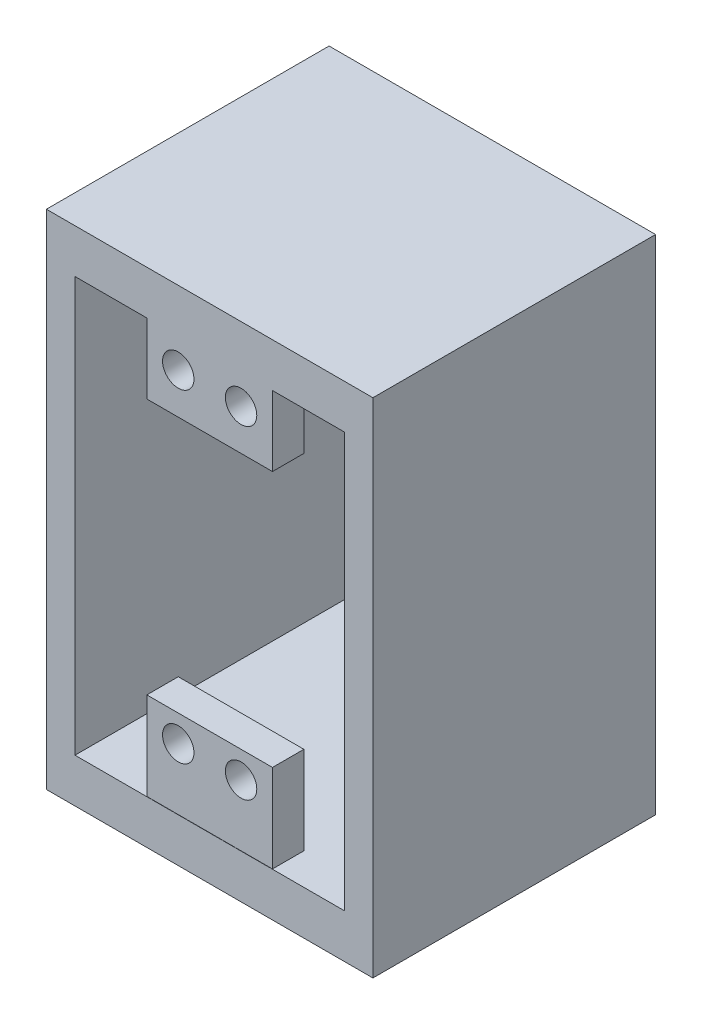
ISO-10303-21;
HEADER;
FILE_DESCRIPTION(('STEP AP214'),'2;1');
FILE_NAME('part.step','',(''),(''),'','','');
FILE_SCHEMA(('AUTOMOTIVE_DESIGN { 1 0 10303 214 1 1 1 1 }'));
ENDSEC;
DATA;
#1=APPLICATION_CONTEXT('core data for automotive mechanical design processes');
#2=APPLICATION_PROTOCOL_DEFINITION('international standard','automotive_design',2000,#1);
#3=PRODUCT_CONTEXT('',#1,'mechanical');
#4=PRODUCT('Part','Part','',(#3));
#5=PRODUCT_RELATED_PRODUCT_CATEGORY('part','',(#4));
#6=PRODUCT_DEFINITION_FORMATION('','',#4);
#7=PRODUCT_DEFINITION_CONTEXT('part definition',#1,'design');
#8=PRODUCT_DEFINITION('design','',#6,#7);
#9=PRODUCT_DEFINITION_SHAPE('','',#8);
#10=(LENGTH_UNIT() NAMED_UNIT(*) SI_UNIT(.MILLI.,.METRE.));
#11=(NAMED_UNIT(*) PLANE_ANGLE_UNIT() SI_UNIT($,.RADIAN.));
#12=(NAMED_UNIT(*) SI_UNIT($,.STERADIAN.) SOLID_ANGLE_UNIT());
#13=UNCERTAINTY_MEASURE_WITH_UNIT(LENGTH_MEASURE(1.E-05),#10,'distance_accuracy_value','');
#14=(GEOMETRIC_REPRESENTATION_CONTEXT(3) GLOBAL_UNCERTAINTY_ASSIGNED_CONTEXT((#13)) GLOBAL_UNIT_ASSIGNED_CONTEXT((#10,
#11,#12)) REPRESENTATION_CONTEXT('',''));
#15=CARTESIAN_POINT('',(0.,0.,0.));
#16=DIRECTION('',(0.,0.,1.));
#17=DIRECTION('',(1.,0.,0.));
#18=AXIS2_PLACEMENT_3D('',#15,#16,#17);
#19=CARTESIAN_POINT('',(0.,0.,0.));
#20=DIRECTION('',(0.,0.,-1.));
#21=DIRECTION('',(-1.,0.,0.));
#22=AXIS2_PLACEMENT_3D('',#19,#20,#21);
#23=PLANE('',#22);
#24=CARTESIAN_POINT('',(-15.,61.2767517072238,0.));
#25=DIRECTION('',(0.,0.,1.));
#26=DIRECTION('',(1.,0.,0.));
#27=AXIS2_PLACEMENT_3D('',#24,#25,#26);
#28=CIRCLE('',#27,2.5);
#29=CARTESIAN_POINT('',(-12.5,61.2767517072238,0.));
#30=VERTEX_POINT('',#29);
#31=EDGE_CURVE('E219',#30,#30,#28,.T.);
#32=ORIENTED_EDGE('',*,*,#31,.T.);
#33=EDGE_LOOP('',(#32));
#34=FACE_BOUND('',#33,.T.);
#35=CARTESIAN_POINT('',(-5.,61.2767517072238,0.));
#36=DIRECTION('',(0.,0.,1.));
#37=DIRECTION('',(1.,0.,0.));
#38=AXIS2_PLACEMENT_3D('',#35,#36,#37);
#39=CIRCLE('',#38,2.5);
#40=CARTESIAN_POINT('',(-2.5,61.2767517072238,0.));
#41=VERTEX_POINT('',#40);
#42=EDGE_CURVE('E215',#41,#41,#39,.T.);
#43=ORIENTED_EDGE('',*,*,#42,.T.);
#44=EDGE_LOOP('',(#43));
#45=FACE_BOUND('',#44,.T.);
#46=DIRECTION('',(0.,-1.,0.));
#47=VECTOR('',#46,1.);
#48=CARTESIAN_POINT('',(-20.,54.79,0.));
#49=LINE('',#48,#47);
#50=CARTESIAN_POINT('',(-20.,65.9619655479105,0.));
#51=VERTEX_POINT('',#50);
#52=CARTESIAN_POINT('',(-20.,54.79,0.));
#53=VERTEX_POINT('',#52);
#54=EDGE_CURVE('E225',#51,#53,#49,.T.);
#55=ORIENTED_EDGE('',*,*,#54,.F.);
#56=DIRECTION('',(1.,0.,0.));
#57=VECTOR('',#56,1.);
#58=CARTESIAN_POINT('',(0.,65.9619655479105,0.));
#59=LINE('',#58,#57);
#60=CARTESIAN_POINT('',(0.,65.9619655479105,0.));
#61=VERTEX_POINT('',#60);
#62=EDGE_CURVE('E206',#51,#61,#59,.T.);
#63=ORIENTED_EDGE('',*,*,#62,.T.);
#64=DIRECTION('',(0.,1.,0.));
#65=VECTOR('',#64,1.);
#66=CARTESIAN_POINT('',(0.,65.97,0.));
#67=LINE('',#66,#65);
#68=CARTESIAN_POINT('',(0.,54.79,0.));
#69=VERTEX_POINT('',#68);
#70=EDGE_CURVE('E230',#69,#61,#67,.T.);
#71=ORIENTED_EDGE('',*,*,#70,.F.);
#72=DIRECTION('',(1.,0.,0.));
#73=VECTOR('',#72,1.);
#74=CARTESIAN_POINT('',(-20.,54.79,0.));
#75=LINE('',#74,#73);
#76=EDGE_CURVE('E237',#53,#69,#75,.T.);
#77=ORIENTED_EDGE('',*,*,#76,.F.);
#78=EDGE_LOOP('',(#55,#63,#71,#77));
#79=FACE_BOUND('',#78,.T.);
#80=ADVANCED_FACE('F46',(#34,#45,#79),#23,.T.);
#81=CARTESIAN_POINT('',(-20.,54.79,5.));
#82=DIRECTION('',(1.,0.,0.));
#83=DIRECTION('',(0.,0.,-1.));
#84=AXIS2_PLACEMENT_3D('',#81,#82,#83);
#85=PLANE('',#84);
#86=DIRECTION('',(0.,0.,1.));
#87=VECTOR('',#86,1.);
#88=CARTESIAN_POINT('',(-20.,65.9619655479105,5.));
#89=LINE('',#88,#87);
#90=CARTESIAN_POINT('',(-20.,65.9619655479105,5.));
#91=VERTEX_POINT('',#90);
#92=EDGE_CURVE('E65',#51,#91,#89,.T.);
#93=ORIENTED_EDGE('',*,*,#92,.F.);
#94=ORIENTED_EDGE('',*,*,#54,.T.);
#95=DIRECTION('',(0.,0.,-1.));
#96=VECTOR('',#95,1.);
#97=CARTESIAN_POINT('',(-20.,54.79,5.));
#98=LINE('',#97,#96);
#99=CARTESIAN_POINT('',(-20.,54.79,5.));
#100=VERTEX_POINT('',#99);
#101=EDGE_CURVE('E54',#100,#53,#98,.T.);
#102=ORIENTED_EDGE('',*,*,#101,.F.);
#103=DIRECTION('',(0.,-1.,0.));
#104=VECTOR('',#103,1.);
#105=CARTESIAN_POINT('',(-20.,54.79,5.));
#106=LINE('',#105,#104);
#107=EDGE_CURVE('E61',#91,#100,#106,.T.);
#108=ORIENTED_EDGE('',*,*,#107,.F.);
#109=EDGE_LOOP('',(#93,#94,#102,#108));
#110=FACE_BOUND('',#109,.T.);
#111=ADVANCED_FACE('F48',(#110),#85,.F.);
#112=CARTESIAN_POINT('',(0.,65.97,5.));
#113=DIRECTION('',(-1.,0.,0.));
#114=DIRECTION('',(0.,0.,1.));
#115=AXIS2_PLACEMENT_3D('',#112,#113,#114);
#116=PLANE('',#115);
#117=DIRECTION('',(0.,0.,-1.));
#118=VECTOR('',#117,1.);
#119=CARTESIAN_POINT('',(0.,65.9619655479105,5.));
#120=LINE('',#119,#118);
#121=CARTESIAN_POINT('',(0.,65.9619655479105,5.));
#122=VERTEX_POINT('',#121);
#123=EDGE_CURVE('E12',#122,#61,#120,.T.);
#124=ORIENTED_EDGE('',*,*,#123,.F.);
#125=DIRECTION('',(0.,1.,0.));
#126=VECTOR('',#125,1.);
#127=CARTESIAN_POINT('',(0.,65.97,5.));
#128=LINE('',#127,#126);
#129=CARTESIAN_POINT('',(0.,54.79,5.));
#130=VERTEX_POINT('',#129);
#131=EDGE_CURVE('E232',#130,#122,#128,.T.);
#132=ORIENTED_EDGE('',*,*,#131,.F.);
#133=DIRECTION('',(0.,0.,-1.));
#134=VECTOR('',#133,1.);
#135=CARTESIAN_POINT('',(0.,54.79,5.));
#136=LINE('',#135,#134);
#137=EDGE_CURVE('E235',#130,#69,#136,.T.);
#138=ORIENTED_EDGE('',*,*,#137,.T.);
#139=ORIENTED_EDGE('',*,*,#70,.T.);
#140=EDGE_LOOP('',(#124,#132,#138,#139));
#141=FACE_BOUND('',#140,.T.);
#142=ADVANCED_FACE('F250',(#141),#116,.F.);
#143=CARTESIAN_POINT('',(0.,0.,5.));
#144=DIRECTION('',(0.,0.,-1.));
#145=DIRECTION('',(-1.,0.,0.));
#146=AXIS2_PLACEMENT_3D('',#143,#144,#145);
#147=PLANE('',#146);
#148=DIRECTION('',(-1.,0.,0.));
#149=VECTOR('',#148,1.);
#150=CARTESIAN_POINT('',(-31.4399784340822,65.9619655479105,5.));
#151=LINE('',#150,#149);
#152=CARTESIAN_POINT('',(-31.4399784340822,65.9619655479105,5.));
#153=VERTEX_POINT('',#152);
#154=EDGE_CURVE('E169',#91,#153,#151,.T.);
#155=ORIENTED_EDGE('',*,*,#154,.F.);
#156=ORIENTED_EDGE('',*,*,#107,.T.);
#157=DIRECTION('',(1.,0.,0.));
#158=VECTOR('',#157,1.);
#159=CARTESIAN_POINT('',(-20.,54.79,5.));
#160=LINE('',#159,#158);
#161=EDGE_CURVE('E229',#100,#130,#160,.T.);
#162=ORIENTED_EDGE('',*,*,#161,.T.);
#163=ORIENTED_EDGE('',*,*,#131,.T.);
#164=CARTESIAN_POINT('',(11.4399784340822,65.9619655479105,5.));
#165=VERTEX_POINT('',#164);
#166=EDGE_CURVE('E170',#165,#122,#151,.T.);
#167=ORIENTED_EDGE('',*,*,#166,.F.);
#168=DIRECTION('',(0.,1.,0.));
#169=VECTOR('',#168,1.);
#170=CARTESIAN_POINT('',(11.4399784340822,65.9619655479105,5.));
#171=LINE('',#170,#169);
#172=CARTESIAN_POINT('',(11.4399784340822,-0.0380344520894693,5.));
#173=VERTEX_POINT('',#172);
#174=EDGE_CURVE('E140',#173,#165,#171,.T.);
#175=ORIENTED_EDGE('',*,*,#174,.F.);
#176=DIRECTION('',(1.,0.,0.));
#177=VECTOR('',#176,1.);
#178=CARTESIAN_POINT('',(-31.4399784340822,-0.0380344520894693,5.));
#179=LINE('',#178,#177);
#180=CARTESIAN_POINT('',(-31.4399784340822,-0.0380344520894693,5.));
#181=VERTEX_POINT('',#180);
#182=EDGE_CURVE('E160',#181,#173,#179,.T.);
#183=ORIENTED_EDGE('',*,*,#182,.F.);
#184=DIRECTION('',(0.,-1.,0.));
#185=VECTOR('',#184,1.);
#186=CARTESIAN_POINT('',(-31.4399784340822,65.9619655479105,5.));
#187=LINE('',#186,#185);
#188=EDGE_CURVE('E163',#153,#181,#187,.T.);
#189=ORIENTED_EDGE('',*,*,#188,.F.);
#190=EDGE_LOOP('',(#155,#156,#162,#163,#167,#175,#183,#189));
#191=FACE_BOUND('',#190,.T.);
#192=DIRECTION('',(0.,1.,0.));
#193=VECTOR('',#192,1.);
#194=CARTESIAN_POINT('',(15.9878526473723,72.9619655479105,5.));
#195=LINE('',#194,#193);
#196=CARTESIAN_POINT('',(15.9878526473723,-7.03803445208947,5.));
#197=VERTEX_POINT('',#196);
#198=CARTESIAN_POINT('',(15.9878526473723,72.9619655479105,5.));
#199=VERTEX_POINT('',#198);
#200=EDGE_CURVE('E176',#197,#199,#195,.T.);
#201=ORIENTED_EDGE('',*,*,#200,.T.);
#202=DIRECTION('',(-1.,0.,0.));
#203=VECTOR('',#202,1.);
#204=CARTESIAN_POINT('',(-35.9878526473723,72.9619655479105,5.));
#205=LINE('',#204,#203);
#206=CARTESIAN_POINT('',(-35.9878526473723,72.9619655479105,5.));
#207=VERTEX_POINT('',#206);
#208=EDGE_CURVE('E196',#199,#207,#205,.T.);
#209=ORIENTED_EDGE('',*,*,#208,.T.);
#210=DIRECTION('',(0.,-1.,0.));
#211=VECTOR('',#210,1.);
#212=CARTESIAN_POINT('',(-35.9878526473723,72.9619655479105,5.));
#213=LINE('',#212,#211);
#214=CARTESIAN_POINT('',(-35.9878526473723,-7.03803445208947,5.));
#215=VERTEX_POINT('',#214);
#216=EDGE_CURVE('E199',#207,#215,#213,.T.);
#217=ORIENTED_EDGE('',*,*,#216,.T.);
#218=DIRECTION('',(1.,0.,0.));
#219=VECTOR('',#218,1.);
#220=CARTESIAN_POINT('',(-35.9878526473723,-7.03803445208947,5.));
#221=LINE('',#220,#219);
#222=EDGE_CURVE('E184',#215,#197,#221,.T.);
#223=ORIENTED_EDGE('',*,*,#222,.T.);
#224=EDGE_LOOP('',(#201,#209,#217,#223));
#225=FACE_BOUND('',#224,.T.);
#226=CARTESIAN_POINT('',(-5.,61.2767517072238,5.));
#227=DIRECTION('',(0.,0.,1.));
#228=DIRECTION('',(1.,0.,0.));
#229=AXIS2_PLACEMENT_3D('',#226,#227,#228);
#230=CIRCLE('',#229,2.5);
#231=CARTESIAN_POINT('',(-2.5,61.2767517072238,5.));
#232=VERTEX_POINT('',#231);
#233=EDGE_CURVE('E216',#232,#232,#230,.T.);
#234=ORIENTED_EDGE('',*,*,#233,.F.);
#235=EDGE_LOOP('',(#234));
#236=FACE_BOUND('',#235,.T.);
#237=CARTESIAN_POINT('',(-15.,61.2767517072238,5.));
#238=DIRECTION('',(0.,0.,1.));
#239=DIRECTION('',(1.,0.,0.));
#240=AXIS2_PLACEMENT_3D('',#237,#238,#239);
#241=CIRCLE('',#240,2.5);
#242=CARTESIAN_POINT('',(-12.5,61.2767517072238,5.));
#243=VERTEX_POINT('',#242);
#244=EDGE_CURVE('E222',#243,#243,#241,.T.);
#245=ORIENTED_EDGE('',*,*,#244,.F.);
#246=EDGE_LOOP('',(#245));
#247=FACE_BOUND('',#246,.T.);
#248=ADVANCED_FACE('F254',(#191,#225,#236,#247),#147,.F.);
#249=CARTESIAN_POINT('',(-20.,54.79,5.));
#250=DIRECTION('',(0.,1.,0.));
#251=DIRECTION('',(0.,0.,1.));
#252=AXIS2_PLACEMENT_3D('',#249,#250,#251);
#253=PLANE('',#252);
#254=ORIENTED_EDGE('',*,*,#76,.T.);
#255=ORIENTED_EDGE('',*,*,#137,.F.);
#256=ORIENTED_EDGE('',*,*,#161,.F.);
#257=ORIENTED_EDGE('',*,*,#101,.T.);
#258=EDGE_LOOP('',(#254,#255,#256,#257));
#259=FACE_BOUND('',#258,.T.);
#260=ADVANCED_FACE('F245',(#259),#253,.F.);
#261=CARTESIAN_POINT('',(-15.,61.2767517072238,5.));
#262=DIRECTION('',(0.,0.,-1.));
#263=DIRECTION('',(-1.,0.,0.));
#264=AXIS2_PLACEMENT_3D('',#261,#262,#263);
#265=CYLINDRICAL_SURFACE('',#264,2.5);
#266=ORIENTED_EDGE('',*,*,#244,.T.);
#267=EDGE_LOOP('',(#266));
#268=FACE_BOUND('',#267,.T.);
#269=ORIENTED_EDGE('',*,*,#31,.F.);
#270=EDGE_LOOP('',(#269));
#271=FACE_BOUND('',#270,.T.);
#272=ADVANCED_FACE('F282',(#268,#271),#265,.F.);
#273=CARTESIAN_POINT('',(-5.,61.2767517072238,5.));
#274=DIRECTION('',(0.,0.,-1.));
#275=DIRECTION('',(-1.,0.,0.));
#276=AXIS2_PLACEMENT_3D('',#273,#274,#275);
#277=CYLINDRICAL_SURFACE('',#276,2.5);
#278=ORIENTED_EDGE('',*,*,#233,.T.);
#279=EDGE_LOOP('',(#278));
#280=FACE_BOUND('',#279,.T.);
#281=ORIENTED_EDGE('',*,*,#42,.F.);
#282=EDGE_LOOP('',(#281));
#283=FACE_BOUND('',#282,.T.);
#284=ADVANCED_FACE('F287',(#280,#283),#277,.F.);
#285=CARTESIAN_POINT('',(-31.4399784340822,65.9619655479105,-40.));
#286=DIRECTION('',(0.,1.,0.));
#287=DIRECTION('',(0.,0.,1.));
#288=AXIS2_PLACEMENT_3D('',#285,#286,#287);
#289=PLANE('',#288);
#290=ORIENTED_EDGE('',*,*,#62,.F.);
#291=ORIENTED_EDGE('',*,*,#92,.T.);
#292=ORIENTED_EDGE('',*,*,#154,.T.);
#293=DIRECTION('',(0.,0.,1.));
#294=VECTOR('',#293,1.);
#295=CARTESIAN_POINT('',(-31.4399784340822,65.9619655479105,-40.));
#296=LINE('',#295,#294);
#297=CARTESIAN_POINT('',(-31.4399784340822,65.9619655479105,-40.));
#298=VERTEX_POINT('',#297);
#299=EDGE_CURVE('E144',#298,#153,#296,.T.);
#300=ORIENTED_EDGE('',*,*,#299,.F.);
#301=DIRECTION('',(-1.,0.,0.));
#302=VECTOR('',#301,1.);
#303=CARTESIAN_POINT('',(-31.4399784340822,65.9619655479105,-40.));
#304=LINE('',#303,#302);
#305=CARTESIAN_POINT('',(11.4399784340822,65.9619655479105,-40.));
#306=VERTEX_POINT('',#305);
#307=EDGE_CURVE('E149',#306,#298,#304,.T.);
#308=ORIENTED_EDGE('',*,*,#307,.F.);
#309=DIRECTION('',(0.,0.,1.));
#310=VECTOR('',#309,1.);
#311=CARTESIAN_POINT('',(11.4399784340822,65.9619655479105,-40.));
#312=LINE('',#311,#310);
#313=EDGE_CURVE('E133',#306,#165,#312,.T.);
#314=ORIENTED_EDGE('',*,*,#313,.T.);
#315=ORIENTED_EDGE('',*,*,#166,.T.);
#316=ORIENTED_EDGE('',*,*,#123,.T.);
#317=EDGE_LOOP('',(#290,#291,#292,#300,#308,#314,#315,#316));
#318=FACE_BOUND('',#317,.T.);
#319=ADVANCED_FACE('F151',(#318),#289,.F.);
#320=CARTESIAN_POINT('',(15.9878526473723,72.9619655479105,-40.));
#321=DIRECTION('',(1.,0.,0.));
#322=DIRECTION('',(0.,1.,0.));
#323=AXIS2_PLACEMENT_3D('',#320,#321,#322);
#324=PLANE('',#323);
#325=ORIENTED_EDGE('',*,*,#200,.F.);
#326=DIRECTION('',(0.,0.,1.));
#327=VECTOR('',#326,1.);
#328=CARTESIAN_POINT('',(15.9878526473723,-7.03803445208947,-40.));
#329=LINE('',#328,#327);
#330=CARTESIAN_POINT('',(15.9878526473723,-7.03803445208947,-40.));
#331=VERTEX_POINT('',#330);
#332=EDGE_CURVE('E204',#331,#197,#329,.T.);
#333=ORIENTED_EDGE('',*,*,#332,.F.);
#334=DIRECTION('',(0.,1.,0.));
#335=VECTOR('',#334,1.);
#336=CARTESIAN_POINT('',(15.9878526473723,72.9619655479105,-40.));
#337=LINE('',#336,#335);
#338=CARTESIAN_POINT('',(15.9878526473723,72.9619655479105,-40.));
#339=VERTEX_POINT('',#338);
#340=EDGE_CURVE('E180',#331,#339,#337,.T.);
#341=ORIENTED_EDGE('',*,*,#340,.T.);
#342=DIRECTION('',(0.,0.,1.));
#343=VECTOR('',#342,1.);
#344=CARTESIAN_POINT('',(15.9878526473723,72.9619655479105,-40.));
#345=LINE('',#344,#343);
#346=EDGE_CURVE('E193',#339,#199,#345,.T.);
#347=ORIENTED_EDGE('',*,*,#346,.T.);
#348=EDGE_LOOP('',(#325,#333,#341,#347));
#349=FACE_BOUND('',#348,.T.);
#350=ADVANCED_FACE('F337',(#349),#324,.T.);
#351=CARTESIAN_POINT('',(-35.9878526473723,-7.03803445208947,-40.));
#352=DIRECTION('',(0.,-1.,0.));
#353=DIRECTION('',(1.,0.,0.));
#354=AXIS2_PLACEMENT_3D('',#351,#352,#353);
#355=PLANE('',#354);
#356=ORIENTED_EDGE('',*,*,#222,.F.);
#357=DIRECTION('',(0.,0.,1.));
#358=VECTOR('',#357,1.);
#359=CARTESIAN_POINT('',(-35.9878526473723,-7.03803445208947,-40.));
#360=LINE('',#359,#358);
#361=CARTESIAN_POINT('',(-35.9878526473723,-7.03803445208947,-40.));
#362=VERTEX_POINT('',#361);
#363=EDGE_CURVE('E207',#362,#215,#360,.T.);
#364=ORIENTED_EDGE('',*,*,#363,.F.);
#365=DIRECTION('',(1.,0.,0.));
#366=VECTOR('',#365,1.);
#367=CARTESIAN_POINT('',(-35.9878526473723,-7.03803445208947,-40.));
#368=LINE('',#367,#366);
#369=EDGE_CURVE('E190',#362,#331,#368,.T.);
#370=ORIENTED_EDGE('',*,*,#369,.T.);
#371=ORIENTED_EDGE('',*,*,#332,.T.);
#372=EDGE_LOOP('',(#356,#364,#370,#371));
#373=FACE_BOUND('',#372,.T.);
#374=ADVANCED_FACE('F345',(#373),#355,.T.);
#375=CARTESIAN_POINT('',(-35.9878526473723,72.9619655479105,-40.));
#376=DIRECTION('',(-1.,0.,0.));
#377=DIRECTION('',(0.,-1.,0.));
#378=AXIS2_PLACEMENT_3D('',#375,#376,#377);
#379=PLANE('',#378);
#380=ORIENTED_EDGE('',*,*,#216,.F.);
#381=DIRECTION('',(0.,0.,1.));
#382=VECTOR('',#381,1.);
#383=CARTESIAN_POINT('',(-35.9878526473723,72.9619655479105,-40.));
#384=LINE('',#383,#382);
#385=CARTESIAN_POINT('',(-35.9878526473723,72.9619655479105,-40.));
#386=VERTEX_POINT('',#385);
#387=EDGE_CURVE('E209',#386,#207,#384,.T.);
#388=ORIENTED_EDGE('',*,*,#387,.F.);
#389=DIRECTION('',(0.,-1.,0.));
#390=VECTOR('',#389,1.);
#391=CARTESIAN_POINT('',(-35.9878526473723,72.9619655479105,-40.));
#392=LINE('',#391,#390);
#393=EDGE_CURVE('E187',#386,#362,#392,.T.);
#394=ORIENTED_EDGE('',*,*,#393,.T.);
#395=ORIENTED_EDGE('',*,*,#363,.T.);
#396=EDGE_LOOP('',(#380,#388,#394,#395));
#397=FACE_BOUND('',#396,.T.);
#398=ADVANCED_FACE('F354',(#397),#379,.T.);
#399=CARTESIAN_POINT('',(-35.9878526473723,72.9619655479105,-40.));
#400=DIRECTION('',(0.,1.,0.));
#401=DIRECTION('',(-1.,0.,0.));
#402=AXIS2_PLACEMENT_3D('',#399,#400,#401);
#403=PLANE('',#402);
#404=ORIENTED_EDGE('',*,*,#208,.F.);
#405=ORIENTED_EDGE('',*,*,#346,.F.);
#406=DIRECTION('',(-1.,0.,0.));
#407=VECTOR('',#406,1.);
#408=CARTESIAN_POINT('',(-35.9878526473723,72.9619655479105,-40.));
#409=LINE('',#408,#407);
#410=EDGE_CURVE('E183',#339,#386,#409,.T.);
#411=ORIENTED_EDGE('',*,*,#410,.T.);
#412=ORIENTED_EDGE('',*,*,#387,.T.);
#413=EDGE_LOOP('',(#404,#405,#411,#412));
#414=FACE_BOUND('',#413,.T.);
#415=ADVANCED_FACE('F363',(#414),#403,.T.);
#416=CARTESIAN_POINT('',(0.,0.,-40.));
#417=DIRECTION('',(0.,0.,1.));
#418=DIRECTION('',(1.,0.,0.));
#419=AXIS2_PLACEMENT_3D('',#416,#417,#418);
#420=PLANE('',#419);
#421=DIRECTION('',(1.,0.,0.));
#422=VECTOR('',#421,1.);
#423=CARTESIAN_POINT('',(-31.4399784340822,-0.0380344520894693,-40.));
#424=LINE('',#423,#422);
#425=CARTESIAN_POINT('',(-31.4399784340822,-0.0380344520894693,-40.));
#426=VERTEX_POINT('',#425);
#427=CARTESIAN_POINT('',(11.4399784340822,-0.0380344520894693,-40.));
#428=VERTEX_POINT('',#427);
#429=EDGE_CURVE('E145',#426,#428,#424,.T.);
#430=ORIENTED_EDGE('',*,*,#429,.T.);
#431=DIRECTION('',(0.,1.,0.));
#432=VECTOR('',#431,1.);
#433=CARTESIAN_POINT('',(11.4399784340822,65.9619655479105,-40.));
#434=LINE('',#433,#432);
#435=EDGE_CURVE('E137',#428,#306,#434,.T.);
#436=ORIENTED_EDGE('',*,*,#435,.T.);
#437=ORIENTED_EDGE('',*,*,#307,.T.);
#438=DIRECTION('',(0.,-1.,0.));
#439=VECTOR('',#438,1.);
#440=CARTESIAN_POINT('',(-31.4399784340822,65.9619655479105,-40.));
#441=LINE('',#440,#439);
#442=EDGE_CURVE('E155',#298,#426,#441,.T.);
#443=ORIENTED_EDGE('',*,*,#442,.T.);
#444=EDGE_LOOP('',(#430,#436,#437,#443));
#445=FACE_BOUND('',#444,.T.);
#446=ORIENTED_EDGE('',*,*,#340,.F.);
#447=ORIENTED_EDGE('',*,*,#369,.F.);
#448=ORIENTED_EDGE('',*,*,#393,.F.);
#449=ORIENTED_EDGE('',*,*,#410,.F.);
#450=EDGE_LOOP('',(#446,#447,#448,#449));
#451=FACE_BOUND('',#450,.T.);
#452=ADVANCED_FACE('F157',(#445,#451),#420,.F.);
#453=CARTESIAN_POINT('',(11.4399784340822,65.9619655479105,-40.));
#454=DIRECTION('',(1.,0.,0.));
#455=DIRECTION('',(0.,1.,0.));
#456=AXIS2_PLACEMENT_3D('',#453,#454,#455);
#457=PLANE('',#456);
#458=ORIENTED_EDGE('',*,*,#174,.T.);
#459=ORIENTED_EDGE('',*,*,#313,.F.);
#460=ORIENTED_EDGE('',*,*,#435,.F.);
#461=DIRECTION('',(0.,0.,1.));
#462=VECTOR('',#461,1.);
#463=CARTESIAN_POINT('',(11.4399784340822,-0.0380344520894693,-40.));
#464=LINE('',#463,#462);
#465=EDGE_CURVE('E174',#428,#173,#464,.T.);
#466=ORIENTED_EDGE('',*,*,#465,.T.);
#467=EDGE_LOOP('',(#458,#459,#460,#466));
#468=FACE_BOUND('',#467,.T.);
#469=ADVANCED_FACE('F135',(#468),#457,.F.);
#470=CARTESIAN_POINT('',(-31.4399784340822,-0.0380344520894693,-40.));
#471=DIRECTION('',(0.,-1.,0.));
#472=DIRECTION('',(0.,0.,-1.));
#473=AXIS2_PLACEMENT_3D('',#470,#471,#472);
#474=PLANE('',#473);
#475=ORIENTED_EDGE('',*,*,#182,.T.);
#476=ORIENTED_EDGE('',*,*,#465,.F.);
#477=ORIENTED_EDGE('',*,*,#429,.F.);
#478=DIRECTION('',(0.,0.,1.));
#479=VECTOR('',#478,1.);
#480=CARTESIAN_POINT('',(-31.4399784340822,-0.0380344520894693,-40.));
#481=LINE('',#480,#479);
#482=EDGE_CURVE('E177',#426,#181,#481,.T.);
#483=ORIENTED_EDGE('',*,*,#482,.T.);
#484=EDGE_LOOP('',(#475,#476,#477,#483));
#485=FACE_BOUND('',#484,.T.);
#486=ADVANCED_FACE('F261',(#485),#474,.F.);
#487=CARTESIAN_POINT('',(-31.4399784340822,65.9619655479105,-40.));
#488=DIRECTION('',(-1.,0.,0.));
#489=DIRECTION('',(0.,-1.,0.));
#490=AXIS2_PLACEMENT_3D('',#487,#488,#489);
#491=PLANE('',#490);
#492=ORIENTED_EDGE('',*,*,#188,.T.);
#493=ORIENTED_EDGE('',*,*,#482,.F.);
#494=ORIENTED_EDGE('',*,*,#442,.F.);
#495=ORIENTED_EDGE('',*,*,#299,.T.);
#496=EDGE_LOOP('',(#492,#493,#494,#495));
#497=FACE_BOUND('',#496,.T.);
#498=ADVANCED_FACE('F259',(#497),#491,.F.);
#499=CLOSED_SHELL('',(#80,#111,#142,#248,#260,#272,#284,#319,#350,#374,#398,#415,#452,#469,#486,#498));
#500=MANIFOLD_SOLID_BREP('B2',#499);
#501=CARTESIAN_POINT('',(0.,0.,5.));
#502=DIRECTION('',(0.,0.,-1.));
#503=DIRECTION('',(-1.,0.,0.));
#504=AXIS2_PLACEMENT_3D('',#501,#502,#503);
#505=PLANE('',#504);
#506=DIRECTION('',(0.,1.,0.));
#507=VECTOR('',#506,1.);
#508=CARTESIAN_POINT('',(0.,0.,5.));
#509=LINE('',#508,#507);
#510=CARTESIAN_POINT('',(0.,0.,5.));
#511=VERTEX_POINT('',#510);
#512=CARTESIAN_POINT('',(0.,14.,5.));
#513=VERTEX_POINT('',#512);
#514=EDGE_CURVE('E475',#511,#513,#509,.T.);
#515=ORIENTED_EDGE('',*,*,#514,.T.);
#516=DIRECTION('',(-1.,0.,0.));
#517=VECTOR('',#516,1.);
#518=CARTESIAN_POINT('',(-20.,14.,5.));
#519=LINE('',#518,#517);
#520=CARTESIAN_POINT('',(-20.,14.,5.));
#521=VERTEX_POINT('',#520);
#522=EDGE_CURVE('E470',#513,#521,#519,.T.);
#523=ORIENTED_EDGE('',*,*,#522,.T.);
#524=DIRECTION('',(0.,-1.,0.));
#525=VECTOR('',#524,1.);
#526=CARTESIAN_POINT('',(-20.,0.,5.));
#527=LINE('',#526,#525);
#528=CARTESIAN_POINT('',(-20.,0.,5.));
#529=VERTEX_POINT('',#528);
#530=EDGE_CURVE('E473',#521,#529,#527,.T.);
#531=ORIENTED_EDGE('',*,*,#530,.T.);
#532=DIRECTION('',(1.,0.,0.));
#533=VECTOR('',#532,1.);
#534=CARTESIAN_POINT('',(0.,0.,5.));
#535=LINE('',#534,#533);
#536=EDGE_CURVE('E440',#529,#511,#535,.T.);
#537=ORIENTED_EDGE('',*,*,#536,.T.);
#538=EDGE_LOOP('',(#515,#523,#531,#537));
#539=FACE_BOUND('',#538,.T.);
#540=CARTESIAN_POINT('',(-5.,9.76121680779124,5.));
#541=DIRECTION('',(0.,0.,1.));
#542=DIRECTION('',(1.,0.,0.));
#543=AXIS2_PLACEMENT_3D('',#540,#541,#542);
#544=CIRCLE('',#543,2.5);
#545=CARTESIAN_POINT('',(-2.5,9.76121680779124,5.));
#546=VERTEX_POINT('',#545);
#547=EDGE_CURVE('E490',#546,#546,#544,.T.);
#548=ORIENTED_EDGE('',*,*,#547,.F.);
#549=EDGE_LOOP('',(#548));
#550=FACE_BOUND('',#549,.T.);
#551=CARTESIAN_POINT('',(-15.,9.76121680779124,5.));
#552=DIRECTION('',(0.,0.,1.));
#553=DIRECTION('',(1.,0.,0.));
#554=AXIS2_PLACEMENT_3D('',#551,#552,#553);
#555=CIRCLE('',#554,2.5);
#556=CARTESIAN_POINT('',(-12.5,9.76121680779124,5.));
#557=VERTEX_POINT('',#556);
#558=EDGE_CURVE('E505',#557,#557,#555,.T.);
#559=ORIENTED_EDGE('',*,*,#558,.F.);
#560=EDGE_LOOP('',(#559));
#561=FACE_BOUND('',#560,.T.);
#562=ADVANCED_FACE('F423',(#539,#550,#561),#505,.F.);
#563=CARTESIAN_POINT('',(0.,0.,0.));
#564=DIRECTION('',(0.,0.,-1.));
#565=DIRECTION('',(-1.,0.,0.));
#566=AXIS2_PLACEMENT_3D('',#563,#564,#565);
#567=PLANE('',#566);
#568=CARTESIAN_POINT('',(-5.,9.76121680779124,0.));
#569=DIRECTION('',(0.,0.,1.));
#570=DIRECTION('',(1.,0.,0.));
#571=AXIS2_PLACEMENT_3D('',#568,#569,#570);
#572=CIRCLE('',#571,2.5);
#573=CARTESIAN_POINT('',(-2.5,9.76121680779124,0.));
#574=VERTEX_POINT('',#573);
#575=EDGE_CURVE('E502',#574,#574,#572,.T.);
#576=ORIENTED_EDGE('',*,*,#575,.T.);
#577=EDGE_LOOP('',(#576));
#578=FACE_BOUND('',#577,.T.);
#579=DIRECTION('',(0.,1.,0.));
#580=VECTOR('',#579,1.);
#581=CARTESIAN_POINT('',(0.,0.,0.));
#582=LINE('',#581,#580);
#583=CARTESIAN_POINT('',(0.,0.,0.));
#584=VERTEX_POINT('',#583);
#585=CARTESIAN_POINT('',(0.,14.,0.));
#586=VERTEX_POINT('',#585);
#587=EDGE_CURVE('E487',#584,#586,#582,.T.);
#588=ORIENTED_EDGE('',*,*,#587,.F.);
#589=DIRECTION('',(1.,0.,0.));
#590=VECTOR('',#589,1.);
#591=CARTESIAN_POINT('',(0.,0.,0.));
#592=LINE('',#591,#590);
#593=CARTESIAN_POINT('',(-20.,0.,0.));
#594=VERTEX_POINT('',#593);
#595=EDGE_CURVE('E463',#594,#584,#592,.T.);
#596=ORIENTED_EDGE('',*,*,#595,.F.);
#597=DIRECTION('',(0.,-1.,0.));
#598=VECTOR('',#597,1.);
#599=CARTESIAN_POINT('',(-20.,0.,0.));
#600=LINE('',#599,#598);
#601=CARTESIAN_POINT('',(-20.,14.,0.));
#602=VERTEX_POINT('',#601);
#603=EDGE_CURVE('E457',#602,#594,#600,.T.);
#604=ORIENTED_EDGE('',*,*,#603,.F.);
#605=DIRECTION('',(-1.,0.,0.));
#606=VECTOR('',#605,1.);
#607=CARTESIAN_POINT('',(-20.,14.,0.));
#608=LINE('',#607,#606);
#609=EDGE_CURVE('E479',#586,#602,#608,.T.);
#610=ORIENTED_EDGE('',*,*,#609,.F.);
#611=EDGE_LOOP('',(#588,#596,#604,#610));
#612=FACE_BOUND('',#611,.T.);
#613=CARTESIAN_POINT('',(-15.,9.76121680779124,0.));
#614=DIRECTION('',(0.,0.,1.));
#615=DIRECTION('',(1.,0.,0.));
#616=AXIS2_PLACEMENT_3D('',#613,#614,#615);
#617=CIRCLE('',#616,2.5);
#618=CARTESIAN_POINT('',(-12.5,9.76121680779124,0.));
#619=VERTEX_POINT('',#618);
#620=EDGE_CURVE('E508',#619,#619,#617,.T.);
#621=ORIENTED_EDGE('',*,*,#620,.T.);
#622=EDGE_LOOP('',(#621));
#623=FACE_BOUND('',#622,.T.);
#624=ADVANCED_FACE('F498',(#578,#612,#623),#567,.T.);
#625=CARTESIAN_POINT('',(0.,0.,5.));
#626=DIRECTION('',(-1.,0.,0.));
#627=DIRECTION('',(0.,0.,1.));
#628=AXIS2_PLACEMENT_3D('',#625,#626,#627);
#629=PLANE('',#628);
#630=ORIENTED_EDGE('',*,*,#587,.T.);
#631=DIRECTION('',(0.,0.,-1.));
#632=VECTOR('',#631,1.);
#633=CARTESIAN_POINT('',(0.,14.,5.));
#634=LINE('',#633,#632);
#635=EDGE_CURVE('E44',#513,#586,#634,.T.);
#636=ORIENTED_EDGE('',*,*,#635,.F.);
#637=ORIENTED_EDGE('',*,*,#514,.F.);
#638=DIRECTION('',(0.,0.,-1.));
#639=VECTOR('',#638,1.);
#640=CARTESIAN_POINT('',(0.,0.,5.));
#641=LINE('',#640,#639);
#642=EDGE_CURVE('E483',#511,#584,#641,.T.);
#643=ORIENTED_EDGE('',*,*,#642,.T.);
#644=EDGE_LOOP('',(#630,#636,#637,#643));
#645=FACE_BOUND('',#644,.T.);
#646=ADVANCED_FACE('F425',(#645),#629,.F.);
#647=CARTESIAN_POINT('',(-20.,14.,5.));
#648=DIRECTION('',(0.,-1.,0.));
#649=DIRECTION('',(0.,0.,-1.));
#650=AXIS2_PLACEMENT_3D('',#647,#648,#649);
#651=PLANE('',#650);
#652=ORIENTED_EDGE('',*,*,#609,.T.);
#653=DIRECTION('',(0.,0.,-1.));
#654=VECTOR('',#653,1.);
#655=CARTESIAN_POINT('',(-20.,14.,5.));
#656=LINE('',#655,#654);
#657=EDGE_CURVE('E432',#521,#602,#656,.T.);
#658=ORIENTED_EDGE('',*,*,#657,.F.);
#659=ORIENTED_EDGE('',*,*,#522,.F.);
#660=ORIENTED_EDGE('',*,*,#635,.T.);
#661=EDGE_LOOP('',(#652,#658,#659,#660));
#662=FACE_BOUND('',#661,.T.);
#663=ADVANCED_FACE('F478',(#662),#651,.F.);
#664=CARTESIAN_POINT('',(-20.,0.,5.));
#665=DIRECTION('',(1.,0.,0.));
#666=DIRECTION('',(0.,1.,0.));
#667=AXIS2_PLACEMENT_3D('',#664,#665,#666);
#668=PLANE('',#667);
#669=ORIENTED_EDGE('',*,*,#603,.T.);
#670=DIRECTION('',(0.,0.,-1.));
#671=VECTOR('',#670,1.);
#672=CARTESIAN_POINT('',(-20.,0.,5.));
#673=LINE('',#672,#671);
#674=EDGE_CURVE('E480',#529,#594,#673,.T.);
#675=ORIENTED_EDGE('',*,*,#674,.F.);
#676=ORIENTED_EDGE('',*,*,#530,.F.);
#677=ORIENTED_EDGE('',*,*,#657,.T.);
#678=EDGE_LOOP('',(#669,#675,#676,#677));
#679=FACE_BOUND('',#678,.T.);
#680=ADVANCED_FACE('F481',(#679),#668,.F.);
#681=CARTESIAN_POINT('',(0.,0.,5.));
#682=DIRECTION('',(0.,1.,0.));
#683=DIRECTION('',(-1.,0.,0.));
#684=AXIS2_PLACEMENT_3D('',#681,#682,#683);
#685=PLANE('',#684);
#686=ORIENTED_EDGE('',*,*,#595,.T.);
#687=ORIENTED_EDGE('',*,*,#642,.F.);
#688=ORIENTED_EDGE('',*,*,#536,.F.);
#689=ORIENTED_EDGE('',*,*,#674,.T.);
#690=EDGE_LOOP('',(#686,#687,#688,#689));
#691=FACE_BOUND('',#690,.T.);
#692=ADVANCED_FACE('F495',(#691),#685,.F.);
#693=CARTESIAN_POINT('',(-5.,9.76121680779124,5.));
#694=DIRECTION('',(0.,0.,-1.));
#695=DIRECTION('',(-1.,0.,0.));
#696=AXIS2_PLACEMENT_3D('',#693,#694,#695);
#697=CYLINDRICAL_SURFACE('',#696,2.5);
#698=ORIENTED_EDGE('',*,*,#547,.T.);
#699=EDGE_LOOP('',(#698));
#700=FACE_BOUND('',#699,.T.);
#701=ORIENTED_EDGE('',*,*,#575,.F.);
#702=EDGE_LOOP('',(#701));
#703=FACE_BOUND('',#702,.T.);
#704=ADVANCED_FACE('F525',(#700,#703),#697,.F.);
#705=CARTESIAN_POINT('',(-15.,9.76121680779124,5.));
#706=DIRECTION('',(0.,0.,-1.));
#707=DIRECTION('',(-1.,0.,0.));
#708=AXIS2_PLACEMENT_3D('',#705,#706,#707);
#709=CYLINDRICAL_SURFACE('',#708,2.5);
#710=ORIENTED_EDGE('',*,*,#558,.T.);
#711=EDGE_LOOP('',(#710));
#712=FACE_BOUND('',#711,.T.);
#713=ORIENTED_EDGE('',*,*,#620,.F.);
#714=EDGE_LOOP('',(#713));
#715=FACE_BOUND('',#714,.T.);
#716=ADVANCED_FACE('F514',(#712,#715),#709,.F.);
#717=CLOSED_SHELL('',(#562,#624,#646,#663,#680,#692,#704,#716));
#718=MANIFOLD_SOLID_BREP('B6',#717);
#719=ADVANCED_BREP_SHAPE_REPRESENTATION('',(#18,#500,#718),#14);
#720=SHAPE_DEFINITION_REPRESENTATION(#9,#719);
ENDSEC;
END-ISO-10303-21;
